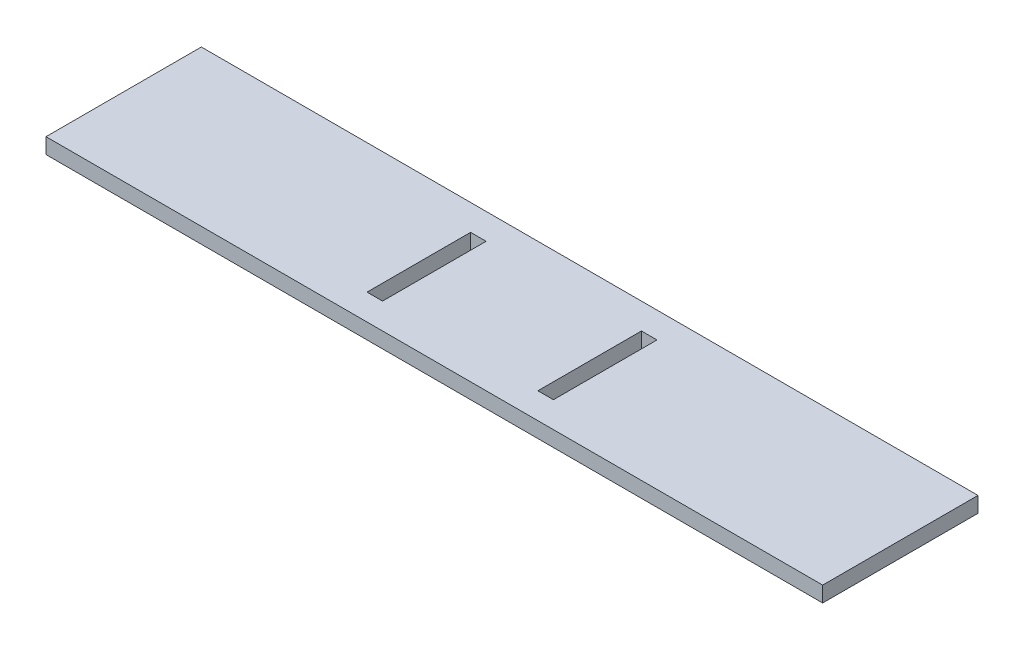
ISO-10303-21;
HEADER;
FILE_DESCRIPTION(('STEP AP214'),'2;1');
FILE_NAME('part.step','',(''),(''),'','','');
FILE_SCHEMA(('AUTOMOTIVE_DESIGN { 1 0 10303 214 1 1 1 1 }'));
ENDSEC;
DATA;
#1=APPLICATION_CONTEXT('core data for automotive mechanical design processes');
#2=APPLICATION_PROTOCOL_DEFINITION('international standard','automotive_design',2000,#1);
#3=PRODUCT_CONTEXT('',#1,'mechanical');
#4=PRODUCT('Part','Part','',(#3));
#5=PRODUCT_RELATED_PRODUCT_CATEGORY('part','',(#4));
#6=PRODUCT_DEFINITION_FORMATION('','',#4);
#7=PRODUCT_DEFINITION_CONTEXT('part definition',#1,'design');
#8=PRODUCT_DEFINITION('design','',#6,#7);
#9=PRODUCT_DEFINITION_SHAPE('','',#8);
#10=(LENGTH_UNIT() NAMED_UNIT(*) SI_UNIT(.MILLI.,.METRE.));
#11=(NAMED_UNIT(*) PLANE_ANGLE_UNIT() SI_UNIT($,.RADIAN.));
#12=(NAMED_UNIT(*) SI_UNIT($,.STERADIAN.) SOLID_ANGLE_UNIT());
#13=UNCERTAINTY_MEASURE_WITH_UNIT(LENGTH_MEASURE(1.E-05),#10,'distance_accuracy_value','');
#14=(GEOMETRIC_REPRESENTATION_CONTEXT(3) GLOBAL_UNCERTAINTY_ASSIGNED_CONTEXT((#13)) GLOBAL_UNIT_ASSIGNED_CONTEXT((#10,
#11,#12)) REPRESENTATION_CONTEXT('',''));
#15=CARTESIAN_POINT('',(0.,0.,0.));
#16=DIRECTION('',(0.,0.,1.));
#17=DIRECTION('',(1.,0.,0.));
#18=AXIS2_PLACEMENT_3D('',#15,#16,#17);
#19=CARTESIAN_POINT('',(0.,3.,0.));
#20=DIRECTION('',(0.,-1.,0.));
#21=DIRECTION('',(0.,0.,-1.));
#22=AXIS2_PLACEMENT_3D('',#19,#20,#21);
#23=PLANE('',#22);
#24=DIRECTION('',(0.,0.,-1.));
#25=VECTOR('',#24,1.);
#26=CARTESIAN_POINT('',(60.,3.,-5.00000000000001));
#27=LINE('',#26,#25);
#28=CARTESIAN_POINT('',(60.,3.,-5.00000000000001));
#29=VERTEX_POINT('',#28);
#30=CARTESIAN_POINT('',(60.,3.,-25.));
#31=VERTEX_POINT('',#30);
#32=EDGE_CURVE('E158',#29,#31,#27,.T.);
#33=ORIENTED_EDGE('',*,*,#32,.F.);
#34=DIRECTION('',(1.,0.,0.));
#35=VECTOR('',#34,1.);
#36=CARTESIAN_POINT('',(60.,3.,-5.00000000000001));
#37=LINE('',#36,#35);
#38=CARTESIAN_POINT('',(57.,3.,-5.00000000000001));
#39=VERTEX_POINT('',#38);
#40=EDGE_CURVE('E166',#39,#29,#37,.T.);
#41=ORIENTED_EDGE('',*,*,#40,.F.);
#42=DIRECTION('',(0.,0.,1.));
#43=VECTOR('',#42,1.);
#44=CARTESIAN_POINT('',(57.,3.,-5.00000000000001));
#45=LINE('',#44,#43);
#46=CARTESIAN_POINT('',(57.,3.,-25.));
#47=VERTEX_POINT('',#46);
#48=EDGE_CURVE('E163',#47,#39,#45,.T.);
#49=ORIENTED_EDGE('',*,*,#48,.F.);
#50=DIRECTION('',(-1.,0.,0.));
#51=VECTOR('',#50,1.);
#52=CARTESIAN_POINT('',(60.,3.,-25.));
#53=LINE('',#52,#51);
#54=EDGE_CURVE('E160',#31,#47,#53,.T.);
#55=ORIENTED_EDGE('',*,*,#54,.F.);
#56=EDGE_LOOP('',(#33,#41,#49,#55));
#57=FACE_BOUND('',#56,.T.);
#58=DIRECTION('',(0.,0.,1.));
#59=VECTOR('',#58,1.);
#60=CARTESIAN_POINT('',(0.,3.,0.));
#61=LINE('',#60,#59);
#62=CARTESIAN_POINT('',(0.,3.,-30.));
#63=VERTEX_POINT('',#62);
#64=CARTESIAN_POINT('',(0.,3.,0.));
#65=VERTEX_POINT('',#64);
#66=EDGE_CURVE('E189',#63,#65,#61,.T.);
#67=ORIENTED_EDGE('',*,*,#66,.T.);
#68=DIRECTION('',(1.,0.,0.));
#69=VECTOR('',#68,1.);
#70=CARTESIAN_POINT('',(0.,3.,0.));
#71=LINE('',#70,#69);
#72=CARTESIAN_POINT('',(150.,3.,0.));
#73=VERTEX_POINT('',#72);
#74=EDGE_CURVE('E192',#65,#73,#71,.T.);
#75=ORIENTED_EDGE('',*,*,#74,.T.);
#76=DIRECTION('',(0.,0.,-1.));
#77=VECTOR('',#76,1.);
#78=CARTESIAN_POINT('',(150.,3.,0.));
#79=LINE('',#78,#77);
#80=CARTESIAN_POINT('',(150.,3.,-30.));
#81=VERTEX_POINT('',#80);
#82=EDGE_CURVE('E195',#73,#81,#79,.T.);
#83=ORIENTED_EDGE('',*,*,#82,.T.);
#84=DIRECTION('',(-1.,0.,0.));
#85=VECTOR('',#84,1.);
#86=CARTESIAN_POINT('',(0.,3.,-30.));
#87=LINE('',#86,#85);
#88=EDGE_CURVE('E197',#81,#63,#87,.T.);
#89=ORIENTED_EDGE('',*,*,#88,.T.);
#90=EDGE_LOOP('',(#67,#75,#83,#89));
#91=FACE_BOUND('',#90,.T.);
#92=DIRECTION('',(0.,0.,1.));
#93=VECTOR('',#92,1.);
#94=CARTESIAN_POINT('',(90.,3.,-5.00000000000001));
#95=LINE('',#94,#93);
#96=CARTESIAN_POINT('',(90.,3.,-25.));
#97=VERTEX_POINT('',#96);
#98=CARTESIAN_POINT('',(90.,3.,-5.00000000000001));
#99=VERTEX_POINT('',#98);
#100=EDGE_CURVE('E122',#97,#99,#95,.T.);
#101=ORIENTED_EDGE('',*,*,#100,.F.);
#102=DIRECTION('',(-1.,0.,0.));
#103=VECTOR('',#102,1.);
#104=CARTESIAN_POINT('',(90.,3.,-25.));
#105=LINE('',#104,#103);
#106=CARTESIAN_POINT('',(93.,3.,-25.));
#107=VERTEX_POINT('',#106);
#108=EDGE_CURVE('E144',#107,#97,#105,.T.);
#109=ORIENTED_EDGE('',*,*,#108,.F.);
#110=DIRECTION('',(0.,0.,-1.));
#111=VECTOR('',#110,1.);
#112=CARTESIAN_POINT('',(93.,3.,-5.00000000000001));
#113=LINE('',#112,#111);
#114=CARTESIAN_POINT('',(93.,3.,-5.00000000000001));
#115=VERTEX_POINT('',#114);
#116=EDGE_CURVE('E142',#115,#107,#113,.T.);
#117=ORIENTED_EDGE('',*,*,#116,.F.);
#118=DIRECTION('',(1.,0.,0.));
#119=VECTOR('',#118,1.);
#120=CARTESIAN_POINT('',(90.,3.,-5.00000000000001));
#121=LINE('',#120,#119);
#122=EDGE_CURVE('E130',#99,#115,#121,.T.);
#123=ORIENTED_EDGE('',*,*,#122,.F.);
#124=EDGE_LOOP('',(#101,#109,#117,#123));
#125=FACE_BOUND('',#124,.T.);
#126=ADVANCED_FACE('F33',(#57,#91,#125),#23,.F.);
#127=CARTESIAN_POINT('',(0.,0.,0.));
#128=DIRECTION('',(0.,-1.,0.));
#129=DIRECTION('',(0.,0.,-1.));
#130=AXIS2_PLACEMENT_3D('',#127,#128,#129);
#131=PLANE('',#130);
#132=DIRECTION('',(0.,0.,1.));
#133=VECTOR('',#132,1.);
#134=CARTESIAN_POINT('',(0.,0.,0.));
#135=LINE('',#134,#133);
#136=CARTESIAN_POINT('',(0.,0.,-30.));
#137=VERTEX_POINT('',#136);
#138=CARTESIAN_POINT('',(0.,0.,0.));
#139=VERTEX_POINT('',#138);
#140=EDGE_CURVE('E188',#137,#139,#135,.T.);
#141=ORIENTED_EDGE('',*,*,#140,.F.);
#142=DIRECTION('',(-1.,0.,0.));
#143=VECTOR('',#142,1.);
#144=CARTESIAN_POINT('',(0.,0.,-30.));
#145=LINE('',#144,#143);
#146=CARTESIAN_POINT('',(150.,0.,-30.));
#147=VERTEX_POINT('',#146);
#148=EDGE_CURVE('E193',#147,#137,#145,.T.);
#149=ORIENTED_EDGE('',*,*,#148,.F.);
#150=DIRECTION('',(0.,0.,-1.));
#151=VECTOR('',#150,1.);
#152=CARTESIAN_POINT('',(150.,0.,0.));
#153=LINE('',#152,#151);
#154=CARTESIAN_POINT('',(150.,0.,0.));
#155=VERTEX_POINT('',#154);
#156=EDGE_CURVE('E204',#155,#147,#153,.T.);
#157=ORIENTED_EDGE('',*,*,#156,.F.);
#158=DIRECTION('',(1.,0.,0.));
#159=VECTOR('',#158,1.);
#160=CARTESIAN_POINT('',(0.,0.,0.));
#161=LINE('',#160,#159);
#162=EDGE_CURVE('E202',#139,#155,#161,.T.);
#163=ORIENTED_EDGE('',*,*,#162,.F.);
#164=EDGE_LOOP('',(#141,#149,#157,#163));
#165=FACE_BOUND('',#164,.T.);
#166=DIRECTION('',(1.,0.,0.));
#167=VECTOR('',#166,1.);
#168=CARTESIAN_POINT('',(60.,0.,-5.00000000000001));
#169=LINE('',#168,#167);
#170=CARTESIAN_POINT('',(57.,0.,-5.00000000000001));
#171=VERTEX_POINT('',#170);
#172=CARTESIAN_POINT('',(60.,0.,-5.00000000000001));
#173=VERTEX_POINT('',#172);
#174=EDGE_CURVE('E161',#171,#173,#169,.T.);
#175=ORIENTED_EDGE('',*,*,#174,.T.);
#176=DIRECTION('',(0.,0.,-1.));
#177=VECTOR('',#176,1.);
#178=CARTESIAN_POINT('',(60.,0.,-5.00000000000001));
#179=LINE('',#178,#177);
#180=CARTESIAN_POINT('',(60.,0.,-25.));
#181=VERTEX_POINT('',#180);
#182=EDGE_CURVE('E138',#173,#181,#179,.T.);
#183=ORIENTED_EDGE('',*,*,#182,.T.);
#184=DIRECTION('',(-1.,0.,0.));
#185=VECTOR('',#184,1.);
#186=CARTESIAN_POINT('',(60.,0.,-25.));
#187=LINE('',#186,#185);
#188=CARTESIAN_POINT('',(57.,0.,-25.));
#189=VERTEX_POINT('',#188);
#190=EDGE_CURVE('E171',#181,#189,#187,.T.);
#191=ORIENTED_EDGE('',*,*,#190,.T.);
#192=DIRECTION('',(0.,0.,1.));
#193=VECTOR('',#192,1.);
#194=CARTESIAN_POINT('',(57.,0.,-5.00000000000001));
#195=LINE('',#194,#193);
#196=EDGE_CURVE('E174',#189,#171,#195,.T.);
#197=ORIENTED_EDGE('',*,*,#196,.T.);
#198=EDGE_LOOP('',(#175,#183,#191,#197));
#199=FACE_BOUND('',#198,.T.);
#200=DIRECTION('',(-1.,0.,0.));
#201=VECTOR('',#200,1.);
#202=CARTESIAN_POINT('',(90.,0.,-25.));
#203=LINE('',#202,#201);
#204=CARTESIAN_POINT('',(93.,0.,-25.));
#205=VERTEX_POINT('',#204);
#206=CARTESIAN_POINT('',(90.,0.,-25.));
#207=VERTEX_POINT('',#206);
#208=EDGE_CURVE('E131',#205,#207,#203,.T.);
#209=ORIENTED_EDGE('',*,*,#208,.T.);
#210=DIRECTION('',(0.,0.,1.));
#211=VECTOR('',#210,1.);
#212=CARTESIAN_POINT('',(90.,0.,-5.00000000000001));
#213=LINE('',#212,#211);
#214=CARTESIAN_POINT('',(90.,0.,-5.00000000000001));
#215=VERTEX_POINT('',#214);
#216=EDGE_CURVE('E56',#207,#215,#213,.T.);
#217=ORIENTED_EDGE('',*,*,#216,.T.);
#218=DIRECTION('',(1.,0.,0.));
#219=VECTOR('',#218,1.);
#220=CARTESIAN_POINT('',(90.,0.,-5.00000000000001));
#221=LINE('',#220,#219);
#222=CARTESIAN_POINT('',(93.,0.,-5.00000000000001));
#223=VERTEX_POINT('',#222);
#224=EDGE_CURVE('E137',#215,#223,#221,.T.);
#225=ORIENTED_EDGE('',*,*,#224,.T.);
#226=DIRECTION('',(0.,0.,-1.));
#227=VECTOR('',#226,1.);
#228=CARTESIAN_POINT('',(93.,0.,-5.00000000000001));
#229=LINE('',#228,#227);
#230=EDGE_CURVE('E150',#223,#205,#229,.T.);
#231=ORIENTED_EDGE('',*,*,#230,.T.);
#232=EDGE_LOOP('',(#209,#217,#225,#231));
#233=FACE_BOUND('',#232,.T.);
#234=ADVANCED_FACE('F222',(#165,#199,#233),#131,.T.);
#235=CARTESIAN_POINT('',(0.,3.,0.));
#236=DIRECTION('',(1.,0.,0.));
#237=DIRECTION('',(0.,0.,-1.));
#238=AXIS2_PLACEMENT_3D('',#235,#236,#237);
#239=PLANE('',#238);
#240=ORIENTED_EDGE('',*,*,#140,.T.);
#241=DIRECTION('',(0.,-1.,0.));
#242=VECTOR('',#241,1.);
#243=CARTESIAN_POINT('',(0.,3.,0.));
#244=LINE('',#243,#242);
#245=EDGE_CURVE('E11',#65,#139,#244,.T.);
#246=ORIENTED_EDGE('',*,*,#245,.F.);
#247=ORIENTED_EDGE('',*,*,#66,.F.);
#248=DIRECTION('',(0.,-1.,0.));
#249=VECTOR('',#248,1.);
#250=CARTESIAN_POINT('',(0.,3.,-30.));
#251=LINE('',#250,#249);
#252=EDGE_CURVE('E199',#63,#137,#251,.T.);
#253=ORIENTED_EDGE('',*,*,#252,.T.);
#254=EDGE_LOOP('',(#240,#246,#247,#253));
#255=FACE_BOUND('',#254,.T.);
#256=ADVANCED_FACE('F35',(#255),#239,.F.);
#257=CARTESIAN_POINT('',(0.,3.,0.));
#258=DIRECTION('',(0.,0.,-1.));
#259=DIRECTION('',(-1.,0.,0.));
#260=AXIS2_PLACEMENT_3D('',#257,#258,#259);
#261=PLANE('',#260);
#262=ORIENTED_EDGE('',*,*,#162,.T.);
#263=DIRECTION('',(0.,-1.,0.));
#264=VECTOR('',#263,1.);
#265=CARTESIAN_POINT('',(150.,3.,0.));
#266=LINE('',#265,#264);
#267=EDGE_CURVE('E41',#73,#155,#266,.T.);
#268=ORIENTED_EDGE('',*,*,#267,.F.);
#269=ORIENTED_EDGE('',*,*,#74,.F.);
#270=ORIENTED_EDGE('',*,*,#245,.T.);
#271=EDGE_LOOP('',(#262,#268,#269,#270));
#272=FACE_BOUND('',#271,.T.);
#273=ADVANCED_FACE('F232',(#272),#261,.F.);
#274=CARTESIAN_POINT('',(150.,3.,0.));
#275=DIRECTION('',(-1.,0.,0.));
#276=DIRECTION('',(0.,0.,1.));
#277=AXIS2_PLACEMENT_3D('',#274,#275,#276);
#278=PLANE('',#277);
#279=ORIENTED_EDGE('',*,*,#156,.T.);
#280=DIRECTION('',(0.,-1.,0.));
#281=VECTOR('',#280,1.);
#282=CARTESIAN_POINT('',(150.,3.,-30.));
#283=LINE('',#282,#281);
#284=EDGE_CURVE('E209',#81,#147,#283,.T.);
#285=ORIENTED_EDGE('',*,*,#284,.F.);
#286=ORIENTED_EDGE('',*,*,#82,.F.);
#287=ORIENTED_EDGE('',*,*,#267,.T.);
#288=EDGE_LOOP('',(#279,#285,#286,#287));
#289=FACE_BOUND('',#288,.T.);
#290=ADVANCED_FACE('F216',(#289),#278,.F.);
#291=CARTESIAN_POINT('',(0.,3.,-30.));
#292=DIRECTION('',(0.,0.,1.));
#293=DIRECTION('',(1.,0.,0.));
#294=AXIS2_PLACEMENT_3D('',#291,#292,#293);
#295=PLANE('',#294);
#296=ORIENTED_EDGE('',*,*,#148,.T.);
#297=ORIENTED_EDGE('',*,*,#252,.F.);
#298=ORIENTED_EDGE('',*,*,#88,.F.);
#299=ORIENTED_EDGE('',*,*,#284,.T.);
#300=EDGE_LOOP('',(#296,#297,#298,#299));
#301=FACE_BOUND('',#300,.T.);
#302=ADVANCED_FACE('F226',(#301),#295,.F.);
#303=CARTESIAN_POINT('',(60.,3.,-5.00000000000001));
#304=DIRECTION('',(-1.,0.,0.));
#305=DIRECTION('',(0.,0.,1.));
#306=AXIS2_PLACEMENT_3D('',#303,#304,#305);
#307=PLANE('',#306);
#308=ORIENTED_EDGE('',*,*,#182,.F.);
#309=DIRECTION('',(0.,-1.,0.));
#310=VECTOR('',#309,1.);
#311=CARTESIAN_POINT('',(60.,3.,-5.00000000000001));
#312=LINE('',#311,#310);
#313=EDGE_CURVE('E168',#29,#173,#312,.T.);
#314=ORIENTED_EDGE('',*,*,#313,.F.);
#315=ORIENTED_EDGE('',*,*,#32,.T.);
#316=DIRECTION('',(0.,-1.,0.));
#317=VECTOR('',#316,1.);
#318=CARTESIAN_POINT('',(60.,3.,-25.));
#319=LINE('',#318,#317);
#320=EDGE_CURVE('E185',#31,#181,#319,.T.);
#321=ORIENTED_EDGE('',*,*,#320,.T.);
#322=EDGE_LOOP('',(#308,#314,#315,#321));
#323=FACE_BOUND('',#322,.T.);
#324=ADVANCED_FACE('F248',(#323),#307,.T.);
#325=CARTESIAN_POINT('',(60.,3.,-25.));
#326=DIRECTION('',(0.,0.,1.));
#327=DIRECTION('',(1.,0.,0.));
#328=AXIS2_PLACEMENT_3D('',#325,#326,#327);
#329=PLANE('',#328);
#330=ORIENTED_EDGE('',*,*,#190,.F.);
#331=ORIENTED_EDGE('',*,*,#320,.F.);
#332=ORIENTED_EDGE('',*,*,#54,.T.);
#333=DIRECTION('',(0.,-1.,0.));
#334=VECTOR('',#333,1.);
#335=CARTESIAN_POINT('',(57.,3.,-25.));
#336=LINE('',#335,#334);
#337=EDGE_CURVE('E183',#47,#189,#336,.T.);
#338=ORIENTED_EDGE('',*,*,#337,.T.);
#339=EDGE_LOOP('',(#330,#331,#332,#338));
#340=FACE_BOUND('',#339,.T.);
#341=ADVANCED_FACE('F255',(#340),#329,.T.);
#342=CARTESIAN_POINT('',(57.,3.,-5.00000000000001));
#343=DIRECTION('',(1.,0.,0.));
#344=DIRECTION('',(0.,0.,-1.));
#345=AXIS2_PLACEMENT_3D('',#342,#343,#344);
#346=PLANE('',#345);
#347=ORIENTED_EDGE('',*,*,#196,.F.);
#348=ORIENTED_EDGE('',*,*,#337,.F.);
#349=ORIENTED_EDGE('',*,*,#48,.T.);
#350=DIRECTION('',(0.,-1.,0.));
#351=VECTOR('',#350,1.);
#352=CARTESIAN_POINT('',(57.,3.,-5.00000000000001));
#353=LINE('',#352,#351);
#354=EDGE_CURVE('E181',#39,#171,#353,.T.);
#355=ORIENTED_EDGE('',*,*,#354,.T.);
#356=EDGE_LOOP('',(#347,#348,#349,#355));
#357=FACE_BOUND('',#356,.T.);
#358=ADVANCED_FACE('F260',(#357),#346,.T.);
#359=CARTESIAN_POINT('',(60.,3.,-5.00000000000001));
#360=DIRECTION('',(0.,0.,-1.));
#361=DIRECTION('',(-1.,0.,0.));
#362=AXIS2_PLACEMENT_3D('',#359,#360,#361);
#363=PLANE('',#362);
#364=ORIENTED_EDGE('',*,*,#174,.F.);
#365=ORIENTED_EDGE('',*,*,#354,.F.);
#366=ORIENTED_EDGE('',*,*,#40,.T.);
#367=ORIENTED_EDGE('',*,*,#313,.T.);
#368=EDGE_LOOP('',(#364,#365,#366,#367));
#369=FACE_BOUND('',#368,.T.);
#370=ADVANCED_FACE('F266',(#369),#363,.T.);
#371=CARTESIAN_POINT('',(90.,3.,-5.00000000000001));
#372=DIRECTION('',(1.,0.,0.));
#373=DIRECTION('',(0.,0.,-1.));
#374=AXIS2_PLACEMENT_3D('',#371,#372,#373);
#375=PLANE('',#374);
#376=ORIENTED_EDGE('',*,*,#216,.F.);
#377=DIRECTION('',(0.,-1.,0.));
#378=VECTOR('',#377,1.);
#379=CARTESIAN_POINT('',(90.,3.,-25.));
#380=LINE('',#379,#378);
#381=EDGE_CURVE('E126',#97,#207,#380,.T.);
#382=ORIENTED_EDGE('',*,*,#381,.F.);
#383=ORIENTED_EDGE('',*,*,#100,.T.);
#384=DIRECTION('',(0.,-1.,0.));
#385=VECTOR('',#384,1.);
#386=CARTESIAN_POINT('',(90.,3.,-5.00000000000001));
#387=LINE('',#386,#385);
#388=EDGE_CURVE('E125',#99,#215,#387,.T.);
#389=ORIENTED_EDGE('',*,*,#388,.T.);
#390=EDGE_LOOP('',(#376,#382,#383,#389));
#391=FACE_BOUND('',#390,.T.);
#392=ADVANCED_FACE('F124',(#391),#375,.T.);
#393=CARTESIAN_POINT('',(90.,3.,-5.00000000000001));
#394=DIRECTION('',(0.,0.,-1.));
#395=DIRECTION('',(-1.,0.,0.));
#396=AXIS2_PLACEMENT_3D('',#393,#394,#395);
#397=PLANE('',#396);
#398=ORIENTED_EDGE('',*,*,#224,.F.);
#399=ORIENTED_EDGE('',*,*,#388,.F.);
#400=ORIENTED_EDGE('',*,*,#122,.T.);
#401=DIRECTION('',(0.,-1.,0.));
#402=VECTOR('',#401,1.);
#403=CARTESIAN_POINT('',(93.,3.,-5.00000000000001));
#404=LINE('',#403,#402);
#405=EDGE_CURVE('E139',#115,#223,#404,.T.);
#406=ORIENTED_EDGE('',*,*,#405,.T.);
#407=EDGE_LOOP('',(#398,#399,#400,#406));
#408=FACE_BOUND('',#407,.T.);
#409=ADVANCED_FACE('F134',(#408),#397,.T.);
#410=CARTESIAN_POINT('',(93.,3.,-5.00000000000001));
#411=DIRECTION('',(-1.,0.,0.));
#412=DIRECTION('',(0.,0.,1.));
#413=AXIS2_PLACEMENT_3D('',#410,#411,#412);
#414=PLANE('',#413);
#415=ORIENTED_EDGE('',*,*,#230,.F.);
#416=ORIENTED_EDGE('',*,*,#405,.F.);
#417=ORIENTED_EDGE('',*,*,#116,.T.);
#418=DIRECTION('',(0.,-1.,0.));
#419=VECTOR('',#418,1.);
#420=CARTESIAN_POINT('',(93.,3.,-25.));
#421=LINE('',#420,#419);
#422=EDGE_CURVE('E48',#107,#205,#421,.T.);
#423=ORIENTED_EDGE('',*,*,#422,.T.);
#424=EDGE_LOOP('',(#415,#416,#417,#423));
#425=FACE_BOUND('',#424,.T.);
#426=ADVANCED_FACE('F285',(#425),#414,.T.);
#427=CARTESIAN_POINT('',(90.,3.,-25.));
#428=DIRECTION('',(0.,0.,1.));
#429=DIRECTION('',(1.,0.,0.));
#430=AXIS2_PLACEMENT_3D('',#427,#428,#429);
#431=PLANE('',#430);
#432=ORIENTED_EDGE('',*,*,#208,.F.);
#433=ORIENTED_EDGE('',*,*,#422,.F.);
#434=ORIENTED_EDGE('',*,*,#108,.T.);
#435=ORIENTED_EDGE('',*,*,#381,.T.);
#436=EDGE_LOOP('',(#432,#433,#434,#435));
#437=FACE_BOUND('',#436,.T.);
#438=ADVANCED_FACE('F288',(#437),#431,.T.);
#439=CLOSED_SHELL('',(#126,#234,#256,#273,#290,#302,#324,#341,#358,#370,#392,#409,#426,#438));
#440=MANIFOLD_SOLID_BREP('B2',#439);
#441=ADVANCED_BREP_SHAPE_REPRESENTATION('',(#18,#440),#14);
#442=SHAPE_DEFINITION_REPRESENTATION(#9,#441);
ENDSEC;
END-ISO-10303-21;
